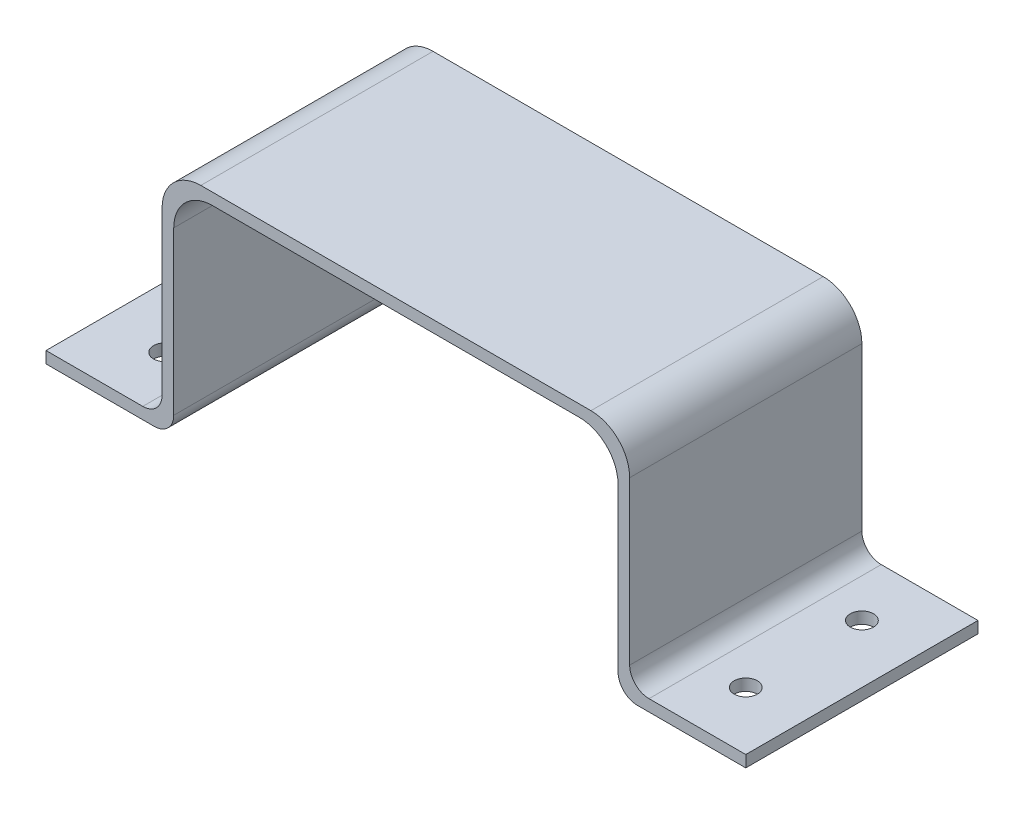
ISO-10303-21;
HEADER;
FILE_DESCRIPTION(('STEP AP214'),'2;1');
FILE_NAME('part.step','',(''),(''),'','','');
FILE_SCHEMA(('AUTOMOTIVE_DESIGN { 1 0 10303 214 1 1 1 1 }'));
ENDSEC;
DATA;
#1=APPLICATION_CONTEXT('core data for automotive mechanical design processes');
#2=APPLICATION_PROTOCOL_DEFINITION('international standard','automotive_design',2000,#1);
#3=PRODUCT_CONTEXT('',#1,'mechanical');
#4=PRODUCT('Part','Part','',(#3));
#5=PRODUCT_RELATED_PRODUCT_CATEGORY('part','',(#4));
#6=PRODUCT_DEFINITION_FORMATION('','',#4);
#7=PRODUCT_DEFINITION_CONTEXT('part definition',#1,'design');
#8=PRODUCT_DEFINITION('design','',#6,#7);
#9=PRODUCT_DEFINITION_SHAPE('','',#8);
#10=(LENGTH_UNIT() NAMED_UNIT(*) SI_UNIT(.MILLI.,.METRE.));
#11=(NAMED_UNIT(*) PLANE_ANGLE_UNIT() SI_UNIT($,.RADIAN.));
#12=(NAMED_UNIT(*) SI_UNIT($,.STERADIAN.) SOLID_ANGLE_UNIT());
#13=UNCERTAINTY_MEASURE_WITH_UNIT(LENGTH_MEASURE(1.E-05),#10,'distance_accuracy_value','');
#14=(GEOMETRIC_REPRESENTATION_CONTEXT(3) GLOBAL_UNCERTAINTY_ASSIGNED_CONTEXT((#13)) GLOBAL_UNIT_ASSIGNED_CONTEXT((#10,
#11,#12)) REPRESENTATION_CONTEXT('',''));
#15=CARTESIAN_POINT('',(0.,0.,0.));
#16=DIRECTION('',(0.,0.,1.));
#17=DIRECTION('',(1.,0.,0.));
#18=AXIS2_PLACEMENT_3D('',#15,#16,#17);
#19=CARTESIAN_POINT('',(0.,-59.94,60.));
#20=DIRECTION('',(0.,1.,0.));
#21=DIRECTION('',(0.,0.,1.));
#22=AXIS2_PLACEMENT_3D('',#19,#20,#21);
#23=PLANE('',#22);
#24=CARTESIAN_POINT('',(15.,-59.94,45.));
#25=DIRECTION('',(0.,1.,0.));
#26=DIRECTION('',(0.,0.,1.));
#27=AXIS2_PLACEMENT_3D('',#24,#25,#26);
#28=CIRCLE('',#27,3.);
#29=CARTESIAN_POINT('',(15.,-59.94,48.));
#30=VERTEX_POINT('',#29);
#31=EDGE_CURVE('E633',#30,#30,#28,.T.);
#32=ORIENTED_EDGE('',*,*,#31,.T.);
#33=EDGE_LOOP('',(#32));
#34=FACE_BOUND('',#33,.T.);
#35=CARTESIAN_POINT('',(15.,-59.94,15.));
#36=DIRECTION('',(0.,1.,0.));
#37=DIRECTION('',(0.,0.,1.));
#38=AXIS2_PLACEMENT_3D('',#35,#36,#37);
#39=CIRCLE('',#38,3.);
#40=CARTESIAN_POINT('',(15.,-59.94,18.));
#41=VERTEX_POINT('',#40);
#42=EDGE_CURVE('E223',#41,#41,#39,.T.);
#43=ORIENTED_EDGE('',*,*,#42,.T.);
#44=EDGE_LOOP('',(#43));
#45=FACE_BOUND('',#44,.T.);
#46=DIRECTION('',(1.,0.,0.));
#47=VECTOR('',#46,1.);
#48=CARTESIAN_POINT('',(0.,-59.94,60.));
#49=LINE('',#48,#47);
#50=CARTESIAN_POINT('',(2.00000000000001,-59.94,60.));
#51=VERTEX_POINT('',#50);
#52=CARTESIAN_POINT('',(30.,-59.94,60.));
#53=VERTEX_POINT('',#52);
#54=EDGE_CURVE('E167',#51,#53,#49,.T.);
#55=ORIENTED_EDGE('',*,*,#54,.F.);
#56=DIRECTION('',(0.,0.,-1.));
#57=VECTOR('',#56,1.);
#58=CARTESIAN_POINT('',(2.00000000000001,-59.94,60.));
#59=LINE('',#58,#57);
#60=CARTESIAN_POINT('',(2.00000000000001,-59.94,0.));
#61=VERTEX_POINT('',#60);
#62=EDGE_CURVE('E40',#51,#61,#59,.T.);
#63=ORIENTED_EDGE('',*,*,#62,.T.);
#64=DIRECTION('',(1.,0.,0.));
#65=VECTOR('',#64,1.);
#66=CARTESIAN_POINT('',(0.,-59.94,0.));
#67=LINE('',#66,#65);
#68=CARTESIAN_POINT('',(30.,-59.94,0.));
#69=VERTEX_POINT('',#68);
#70=EDGE_CURVE('E182',#61,#69,#67,.T.);
#71=ORIENTED_EDGE('',*,*,#70,.T.);
#72=DIRECTION('',(0.,0.,-1.));
#73=VECTOR('',#72,1.);
#74=CARTESIAN_POINT('',(30.,-59.94,60.));
#75=LINE('',#74,#73);
#76=EDGE_CURVE('E180',#53,#69,#75,.T.);
#77=ORIENTED_EDGE('',*,*,#76,.F.);
#78=EDGE_LOOP('',(#55,#63,#71,#77));
#79=FACE_BOUND('',#78,.T.);
#80=ADVANCED_FACE('F32',(#34,#45,#79),#23,.F.);
#81=CARTESIAN_POINT('',(30.,-56.94,60.));
#82=DIRECTION('',(1.,0.,0.));
#83=DIRECTION('',(0.,0.,-1.));
#84=AXIS2_PLACEMENT_3D('',#81,#82,#83);
#85=PLANE('',#84);
#86=DIRECTION('',(0.,-1.,0.));
#87=VECTOR('',#86,1.);
#88=CARTESIAN_POINT('',(30.,-56.94,0.));
#89=LINE('',#88,#87);
#90=CARTESIAN_POINT('',(30.,-56.94,0.));
#91=VERTEX_POINT('',#90);
#92=EDGE_CURVE('E222',#91,#69,#89,.T.);
#93=ORIENTED_EDGE('',*,*,#92,.F.);
#94=DIRECTION('',(0.,0.,-1.));
#95=VECTOR('',#94,1.);
#96=CARTESIAN_POINT('',(30.,-56.94,60.));
#97=LINE('',#96,#95);
#98=CARTESIAN_POINT('',(30.,-56.94,60.));
#99=VERTEX_POINT('',#98);
#100=EDGE_CURVE('E187',#99,#91,#97,.T.);
#101=ORIENTED_EDGE('',*,*,#100,.F.);
#102=DIRECTION('',(0.,-1.,0.));
#103=VECTOR('',#102,1.);
#104=CARTESIAN_POINT('',(30.,-56.94,60.));
#105=LINE('',#104,#103);
#106=EDGE_CURVE('E173',#99,#53,#105,.T.);
#107=ORIENTED_EDGE('',*,*,#106,.T.);
#108=ORIENTED_EDGE('',*,*,#76,.T.);
#109=EDGE_LOOP('',(#93,#101,#107,#108));
#110=FACE_BOUND('',#109,.T.);
#111=ADVANCED_FACE('F190',(#110),#85,.T.);
#112=CARTESIAN_POINT('',(0.,-56.94,60.));
#113=DIRECTION('',(0.,1.,0.));
#114=DIRECTION('',(0.,0.,1.));
#115=AXIS2_PLACEMENT_3D('',#112,#113,#114);
#116=PLANE('',#115);
#117=CARTESIAN_POINT('',(15.,-56.94,45.));
#118=DIRECTION('',(0.,1.,0.));
#119=DIRECTION('',(0.,0.,1.));
#120=AXIS2_PLACEMENT_3D('',#117,#118,#119);
#121=CIRCLE('',#120,3.);
#122=CARTESIAN_POINT('',(15.,-56.94,48.));
#123=VERTEX_POINT('',#122);
#124=EDGE_CURVE('E257',#123,#123,#121,.T.);
#125=ORIENTED_EDGE('',*,*,#124,.F.);
#126=EDGE_LOOP('',(#125));
#127=FACE_BOUND('',#126,.T.);
#128=CARTESIAN_POINT('',(15.,-56.94,15.));
#129=DIRECTION('',(0.,1.,0.));
#130=DIRECTION('',(0.,0.,1.));
#131=AXIS2_PLACEMENT_3D('',#128,#129,#130);
#132=CIRCLE('',#131,3.);
#133=CARTESIAN_POINT('',(15.,-56.94,18.));
#134=VERTEX_POINT('',#133);
#135=EDGE_CURVE('E635',#134,#134,#132,.T.);
#136=ORIENTED_EDGE('',*,*,#135,.F.);
#137=EDGE_LOOP('',(#136));
#138=FACE_BOUND('',#137,.T.);
#139=DIRECTION('',(1.,0.,0.));
#140=VECTOR('',#139,1.);
#141=CARTESIAN_POINT('',(0.,-56.94,0.));
#142=LINE('',#141,#140);
#143=CARTESIAN_POINT('',(5.00000000000001,-56.94,0.));
#144=VERTEX_POINT('',#143);
#145=EDGE_CURVE('E225',#144,#91,#142,.T.);
#146=ORIENTED_EDGE('',*,*,#145,.F.);
#147=DIRECTION('',(0.,0.,-1.));
#148=VECTOR('',#147,1.);
#149=CARTESIAN_POINT('',(5.00000000000001,-56.94,60.));
#150=LINE('',#149,#148);
#151=CARTESIAN_POINT('',(5.00000000000001,-56.94,60.));
#152=VERTEX_POINT('',#151);
#153=EDGE_CURVE('E304',#144,#152,#150,.F.);
#154=ORIENTED_EDGE('',*,*,#153,.T.);
#155=DIRECTION('',(1.,0.,0.));
#156=VECTOR('',#155,1.);
#157=CARTESIAN_POINT('',(0.,-56.94,60.));
#158=LINE('',#157,#156);
#159=EDGE_CURVE('E192',#152,#99,#158,.T.);
#160=ORIENTED_EDGE('',*,*,#159,.T.);
#161=ORIENTED_EDGE('',*,*,#100,.T.);
#162=EDGE_LOOP('',(#146,#154,#160,#161));
#163=FACE_BOUND('',#162,.T.);
#164=ADVANCED_FACE('F338',(#127,#138,#163),#116,.T.);
#165=CARTESIAN_POINT('',(0.,0.,60.));
#166=DIRECTION('',(1.,0.,0.));
#167=DIRECTION('',(0.,1.,0.));
#168=AXIS2_PLACEMENT_3D('',#165,#166,#167);
#169=PLANE('',#168);
#170=DIRECTION('',(0.,-1.,0.));
#171=VECTOR('',#170,1.);
#172=CARTESIAN_POINT('',(0.,0.,60.));
#173=LINE('',#172,#171);
#174=CARTESIAN_POINT('',(0.,-10.,60.));
#175=VERTEX_POINT('',#174);
#176=CARTESIAN_POINT('',(0.,-51.94,60.));
#177=VERTEX_POINT('',#176);
#178=EDGE_CURVE('E194',#175,#177,#173,.T.);
#179=ORIENTED_EDGE('',*,*,#178,.T.);
#180=DIRECTION('',(0.,0.,-1.));
#181=VECTOR('',#180,1.);
#182=CARTESIAN_POINT('',(0.,-51.94,0.));
#183=LINE('',#182,#181);
#184=CARTESIAN_POINT('',(0.,-51.94,0.));
#185=VERTEX_POINT('',#184);
#186=EDGE_CURVE('E301',#177,#185,#183,.T.);
#187=ORIENTED_EDGE('',*,*,#186,.T.);
#188=DIRECTION('',(0.,-1.,0.));
#189=VECTOR('',#188,1.);
#190=CARTESIAN_POINT('',(0.,0.,0.));
#191=LINE('',#190,#189);
#192=CARTESIAN_POINT('',(0.,-10.,0.));
#193=VERTEX_POINT('',#192);
#194=EDGE_CURVE('E227',#193,#185,#191,.T.);
#195=ORIENTED_EDGE('',*,*,#194,.F.);
#196=DIRECTION('',(0.,0.,-1.));
#197=VECTOR('',#196,1.);
#198=CARTESIAN_POINT('',(0.,-10.,60.));
#199=LINE('',#198,#197);
#200=EDGE_CURVE('E271',#193,#175,#199,.F.);
#201=ORIENTED_EDGE('',*,*,#200,.T.);
#202=EDGE_LOOP('',(#179,#187,#195,#201));
#203=FACE_BOUND('',#202,.T.);
#204=ADVANCED_FACE('F346',(#203),#169,.T.);
#205=CARTESIAN_POINT('',(0.,0.,60.));
#206=DIRECTION('',(0.,1.,0.));
#207=DIRECTION('',(-1.,0.,0.));
#208=AXIS2_PLACEMENT_3D('',#205,#206,#207);
#209=PLANE('',#208);
#210=DIRECTION('',(1.,0.,0.));
#211=VECTOR('',#210,1.);
#212=CARTESIAN_POINT('',(0.,0.,60.));
#213=LINE('',#212,#211);
#214=CARTESIAN_POINT('',(-110.8,0.,60.));
#215=VERTEX_POINT('',#214);
#216=CARTESIAN_POINT('',(-10.,0.,60.));
#217=VERTEX_POINT('',#216);
#218=EDGE_CURVE('E200',#215,#217,#213,.T.);
#219=ORIENTED_EDGE('',*,*,#218,.T.);
#220=DIRECTION('',(0.,0.,-1.));
#221=VECTOR('',#220,1.);
#222=CARTESIAN_POINT('',(-10.,0.,60.));
#223=LINE('',#222,#221);
#224=CARTESIAN_POINT('',(-10.,0.,0.));
#225=VERTEX_POINT('',#224);
#226=EDGE_CURVE('E264',#217,#225,#223,.T.);
#227=ORIENTED_EDGE('',*,*,#226,.T.);
#228=DIRECTION('',(1.,0.,0.));
#229=VECTOR('',#228,1.);
#230=CARTESIAN_POINT('',(0.,0.,0.));
#231=LINE('',#230,#229);
#232=CARTESIAN_POINT('',(-110.8,0.,0.));
#233=VERTEX_POINT('',#232);
#234=EDGE_CURVE('E230',#233,#225,#231,.T.);
#235=ORIENTED_EDGE('',*,*,#234,.F.);
#236=DIRECTION('',(0.,0.,-1.));
#237=VECTOR('',#236,1.);
#238=CARTESIAN_POINT('',(-110.8,0.,60.));
#239=LINE('',#238,#237);
#240=EDGE_CURVE('E186',#233,#215,#239,.F.);
#241=ORIENTED_EDGE('',*,*,#240,.T.);
#242=EDGE_LOOP('',(#219,#227,#235,#241));
#243=FACE_BOUND('',#242,.T.);
#244=ADVANCED_FACE('F354',(#243),#209,.T.);
#245=CARTESIAN_POINT('',(-120.8,0.,60.));
#246=DIRECTION('',(-1.,0.,0.));
#247=DIRECTION('',(0.,-1.,0.));
#248=AXIS2_PLACEMENT_3D('',#245,#246,#247);
#249=PLANE('',#248);
#250=DIRECTION('',(0.,1.,0.));
#251=VECTOR('',#250,1.);
#252=CARTESIAN_POINT('',(-120.8,0.,0.));
#253=LINE('',#252,#251);
#254=CARTESIAN_POINT('',(-120.8,-51.94,0.));
#255=VERTEX_POINT('',#254);
#256=CARTESIAN_POINT('',(-120.8,-10.,0.));
#257=VERTEX_POINT('',#256);
#258=EDGE_CURVE('E233',#255,#257,#253,.T.);
#259=ORIENTED_EDGE('',*,*,#258,.F.);
#260=DIRECTION('',(0.,0.,-1.));
#261=VECTOR('',#260,1.);
#262=CARTESIAN_POINT('',(-120.8,-51.94,60.));
#263=LINE('',#262,#261);
#264=CARTESIAN_POINT('',(-120.8,-51.94,60.));
#265=VERTEX_POINT('',#264);
#266=EDGE_CURVE('E309',#255,#265,#263,.F.);
#267=ORIENTED_EDGE('',*,*,#266,.T.);
#268=DIRECTION('',(0.,1.,0.));
#269=VECTOR('',#268,1.);
#270=CARTESIAN_POINT('',(-120.8,0.,60.));
#271=LINE('',#270,#269);
#272=CARTESIAN_POINT('',(-120.8,-10.,60.));
#273=VERTEX_POINT('',#272);
#274=EDGE_CURVE('E203',#265,#273,#271,.T.);
#275=ORIENTED_EDGE('',*,*,#274,.T.);
#276=DIRECTION('',(0.,0.,-1.));
#277=VECTOR('',#276,1.);
#278=CARTESIAN_POINT('',(-120.8,-10.,60.));
#279=LINE('',#278,#277);
#280=EDGE_CURVE('E278',#273,#257,#279,.T.);
#281=ORIENTED_EDGE('',*,*,#280,.T.);
#282=EDGE_LOOP('',(#259,#267,#275,#281));
#283=FACE_BOUND('',#282,.T.);
#284=ADVANCED_FACE('F365',(#283),#249,.T.);
#285=CARTESIAN_POINT('',(-120.8,-56.94,60.));
#286=DIRECTION('',(0.,1.,0.));
#287=DIRECTION('',(0.,0.,1.));
#288=AXIS2_PLACEMENT_3D('',#285,#286,#287);
#289=PLANE('',#288);
#290=CARTESIAN_POINT('',(-135.,-56.94,45.));
#291=DIRECTION('',(0.,1.,0.));
#292=DIRECTION('',(0.,0.,1.));
#293=AXIS2_PLACEMENT_3D('',#290,#291,#292);
#294=CIRCLE('',#293,3.);
#295=CARTESIAN_POINT('',(-135.,-56.94,48.));
#296=VERTEX_POINT('',#295);
#297=EDGE_CURVE('E262',#296,#296,#294,.T.);
#298=ORIENTED_EDGE('',*,*,#297,.F.);
#299=EDGE_LOOP('',(#298));
#300=FACE_BOUND('',#299,.T.);
#301=CARTESIAN_POINT('',(-135.,-56.94,15.));
#302=DIRECTION('',(0.,1.,0.));
#303=DIRECTION('',(0.,0.,1.));
#304=AXIS2_PLACEMENT_3D('',#301,#302,#303);
#305=CIRCLE('',#304,3.);
#306=CARTESIAN_POINT('',(-135.,-56.94,18.));
#307=VERTEX_POINT('',#306);
#308=EDGE_CURVE('E258',#307,#307,#305,.T.);
#309=ORIENTED_EDGE('',*,*,#308,.F.);
#310=EDGE_LOOP('',(#309));
#311=FACE_BOUND('',#310,.T.);
#312=DIRECTION('',(1.,0.,0.));
#313=VECTOR('',#312,1.);
#314=CARTESIAN_POINT('',(-120.8,-56.94,60.));
#315=LINE('',#314,#313);
#316=CARTESIAN_POINT('',(-150.8,-56.94,60.));
#317=VERTEX_POINT('',#316);
#318=CARTESIAN_POINT('',(-125.8,-56.94,60.));
#319=VERTEX_POINT('',#318);
#320=EDGE_CURVE('E205',#317,#319,#315,.T.);
#321=ORIENTED_EDGE('',*,*,#320,.T.);
#322=DIRECTION('',(0.,0.,-1.));
#323=VECTOR('',#322,1.);
#324=CARTESIAN_POINT('',(-125.8,-56.94,0.));
#325=LINE('',#324,#323);
#326=CARTESIAN_POINT('',(-125.8,-56.94,0.));
#327=VERTEX_POINT('',#326);
#328=EDGE_CURVE('E306',#319,#327,#325,.T.);
#329=ORIENTED_EDGE('',*,*,#328,.T.);
#330=DIRECTION('',(1.,0.,0.));
#331=VECTOR('',#330,1.);
#332=CARTESIAN_POINT('',(-120.8,-56.94,0.));
#333=LINE('',#332,#331);
#334=CARTESIAN_POINT('',(-150.8,-56.94,0.));
#335=VERTEX_POINT('',#334);
#336=EDGE_CURVE('E235',#335,#327,#333,.T.);
#337=ORIENTED_EDGE('',*,*,#336,.F.);
#338=DIRECTION('',(0.,0.,-1.));
#339=VECTOR('',#338,1.);
#340=CARTESIAN_POINT('',(-150.8,-56.94,60.));
#341=LINE('',#340,#339);
#342=EDGE_CURVE('E251',#317,#335,#341,.T.);
#343=ORIENTED_EDGE('',*,*,#342,.F.);
#344=EDGE_LOOP('',(#321,#329,#337,#343));
#345=FACE_BOUND('',#344,.T.);
#346=ADVANCED_FACE('F374',(#300,#311,#345),#289,.T.);
#347=CARTESIAN_POINT('',(-150.8,-59.94,60.));
#348=DIRECTION('',(-1.,0.,0.));
#349=DIRECTION('',(0.,0.,1.));
#350=AXIS2_PLACEMENT_3D('',#347,#348,#349);
#351=PLANE('',#350);
#352=DIRECTION('',(0.,1.,0.));
#353=VECTOR('',#352,1.);
#354=CARTESIAN_POINT('',(-150.8,-59.94,0.));
#355=LINE('',#354,#353);
#356=CARTESIAN_POINT('',(-150.8,-59.94,0.));
#357=VERTEX_POINT('',#356);
#358=EDGE_CURVE('E238',#357,#335,#355,.T.);
#359=ORIENTED_EDGE('',*,*,#358,.F.);
#360=DIRECTION('',(0.,0.,-1.));
#361=VECTOR('',#360,1.);
#362=CARTESIAN_POINT('',(-150.8,-59.94,60.));
#363=LINE('',#362,#361);
#364=CARTESIAN_POINT('',(-150.8,-59.94,60.));
#365=VERTEX_POINT('',#364);
#366=EDGE_CURVE('E220',#365,#357,#363,.T.);
#367=ORIENTED_EDGE('',*,*,#366,.F.);
#368=DIRECTION('',(0.,1.,0.));
#369=VECTOR('',#368,1.);
#370=CARTESIAN_POINT('',(-150.8,-59.94,60.));
#371=LINE('',#370,#369);
#372=EDGE_CURVE('E208',#365,#317,#371,.T.);
#373=ORIENTED_EDGE('',*,*,#372,.T.);
#374=ORIENTED_EDGE('',*,*,#342,.T.);
#375=EDGE_LOOP('',(#359,#367,#373,#374));
#376=FACE_BOUND('',#375,.T.);
#377=ADVANCED_FACE('F378',(#376),#351,.T.);
#378=CARTESIAN_POINT('',(-120.8,-59.94,60.));
#379=DIRECTION('',(0.,1.,0.));
#380=DIRECTION('',(0.,0.,1.));
#381=AXIS2_PLACEMENT_3D('',#378,#379,#380);
#382=PLANE('',#381);
#383=CARTESIAN_POINT('',(-135.,-59.94,45.));
#384=DIRECTION('',(0.,1.,0.));
#385=DIRECTION('',(0.,0.,1.));
#386=AXIS2_PLACEMENT_3D('',#383,#384,#385);
#387=CIRCLE('',#386,3.);
#388=CARTESIAN_POINT('',(-135.,-59.94,48.));
#389=VERTEX_POINT('',#388);
#390=EDGE_CURVE('E259',#389,#389,#387,.T.);
#391=ORIENTED_EDGE('',*,*,#390,.T.);
#392=EDGE_LOOP('',(#391));
#393=FACE_BOUND('',#392,.T.);
#394=CARTESIAN_POINT('',(-135.,-59.94,15.));
#395=DIRECTION('',(0.,1.,0.));
#396=DIRECTION('',(0.,0.,1.));
#397=AXIS2_PLACEMENT_3D('',#394,#395,#396);
#398=CIRCLE('',#397,3.);
#399=CARTESIAN_POINT('',(-135.,-59.94,18.));
#400=VERTEX_POINT('',#399);
#401=EDGE_CURVE('E254',#400,#400,#398,.T.);
#402=ORIENTED_EDGE('',*,*,#401,.T.);
#403=EDGE_LOOP('',(#402));
#404=FACE_BOUND('',#403,.T.);
#405=DIRECTION('',(1.,0.,0.));
#406=VECTOR('',#405,1.);
#407=CARTESIAN_POINT('',(-120.8,-59.94,0.));
#408=LINE('',#407,#406);
#409=CARTESIAN_POINT('',(-122.8,-59.94,0.));
#410=VERTEX_POINT('',#409);
#411=EDGE_CURVE('E241',#357,#410,#408,.T.);
#412=ORIENTED_EDGE('',*,*,#411,.T.);
#413=DIRECTION('',(0.,0.,-1.));
#414=VECTOR('',#413,1.);
#415=CARTESIAN_POINT('',(-122.8,-59.94,60.));
#416=LINE('',#415,#414);
#417=CARTESIAN_POINT('',(-122.8,-59.94,60.));
#418=VERTEX_POINT('',#417);
#419=EDGE_CURVE('E326',#410,#418,#416,.F.);
#420=ORIENTED_EDGE('',*,*,#419,.T.);
#421=DIRECTION('',(1.,0.,0.));
#422=VECTOR('',#421,1.);
#423=CARTESIAN_POINT('',(-120.8,-59.94,60.));
#424=LINE('',#423,#422);
#425=EDGE_CURVE('E211',#365,#418,#424,.T.);
#426=ORIENTED_EDGE('',*,*,#425,.F.);
#427=ORIENTED_EDGE('',*,*,#366,.T.);
#428=EDGE_LOOP('',(#412,#420,#426,#427));
#429=FACE_BOUND('',#428,.T.);
#430=ADVANCED_FACE('F482',(#393,#404,#429),#382,.F.);
#431=CARTESIAN_POINT('',(-117.8,0.,60.));
#432=DIRECTION('',(-1.,0.,0.));
#433=DIRECTION('',(0.,-1.,0.));
#434=AXIS2_PLACEMENT_3D('',#431,#432,#433);
#435=PLANE('',#434);
#436=DIRECTION('',(0.,1.,0.));
#437=VECTOR('',#436,1.);
#438=CARTESIAN_POINT('',(-117.8,0.,60.));
#439=LINE('',#438,#437);
#440=CARTESIAN_POINT('',(-117.8,-54.94,60.));
#441=VERTEX_POINT('',#440);
#442=CARTESIAN_POINT('',(-117.8,-13.,60.));
#443=VERTEX_POINT('',#442);
#444=EDGE_CURVE('E213',#441,#443,#439,.T.);
#445=ORIENTED_EDGE('',*,*,#444,.F.);
#446=DIRECTION('',(0.,0.,-1.));
#447=VECTOR('',#446,1.);
#448=CARTESIAN_POINT('',(-117.8,-54.94,60.));
#449=LINE('',#448,#447);
#450=CARTESIAN_POINT('',(-117.8,-54.94,0.));
#451=VERTEX_POINT('',#450);
#452=EDGE_CURVE('E319',#441,#451,#449,.T.);
#453=ORIENTED_EDGE('',*,*,#452,.T.);
#454=DIRECTION('',(0.,1.,0.));
#455=VECTOR('',#454,1.);
#456=CARTESIAN_POINT('',(-117.8,0.,0.));
#457=LINE('',#456,#455);
#458=CARTESIAN_POINT('',(-117.8,-13.,0.));
#459=VERTEX_POINT('',#458);
#460=EDGE_CURVE('E244',#451,#459,#457,.T.);
#461=ORIENTED_EDGE('',*,*,#460,.T.);
#462=DIRECTION('',(0.,0.,-1.));
#463=VECTOR('',#462,1.);
#464=CARTESIAN_POINT('',(-117.8,-13.,60.));
#465=LINE('',#464,#463);
#466=EDGE_CURVE('E286',#459,#443,#465,.F.);
#467=ORIENTED_EDGE('',*,*,#466,.T.);
#468=EDGE_LOOP('',(#445,#453,#461,#467));
#469=FACE_BOUND('',#468,.T.);
#470=ADVANCED_FACE('F389',(#469),#435,.F.);
#471=CARTESIAN_POINT('',(0.,-3.,60.));
#472=DIRECTION('',(0.,1.,0.));
#473=DIRECTION('',(-1.,0.,0.));
#474=AXIS2_PLACEMENT_3D('',#471,#472,#473);
#475=PLANE('',#474);
#476=DIRECTION('',(1.,0.,0.));
#477=VECTOR('',#476,1.);
#478=CARTESIAN_POINT('',(0.,-3.,60.));
#479=LINE('',#478,#477);
#480=CARTESIAN_POINT('',(-107.8,-3.00000000000001,60.));
#481=VERTEX_POINT('',#480);
#482=CARTESIAN_POINT('',(-13.,-3.,60.));
#483=VERTEX_POINT('',#482);
#484=EDGE_CURVE('E215',#481,#483,#479,.T.);
#485=ORIENTED_EDGE('',*,*,#484,.F.);
#486=DIRECTION('',(0.,0.,-1.));
#487=VECTOR('',#486,1.);
#488=CARTESIAN_POINT('',(-107.8,-3.00000000000001,0.));
#489=LINE('',#488,#487);
#490=CARTESIAN_POINT('',(-107.8,-3.00000000000001,0.));
#491=VERTEX_POINT('',#490);
#492=EDGE_CURVE('E283',#481,#491,#489,.T.);
#493=ORIENTED_EDGE('',*,*,#492,.T.);
#494=DIRECTION('',(1.,0.,0.));
#495=VECTOR('',#494,1.);
#496=CARTESIAN_POINT('',(0.,-3.,0.));
#497=LINE('',#496,#495);
#498=CARTESIAN_POINT('',(-13.,-3.,0.));
#499=VERTEX_POINT('',#498);
#500=EDGE_CURVE('E246',#491,#499,#497,.T.);
#501=ORIENTED_EDGE('',*,*,#500,.T.);
#502=DIRECTION('',(0.,0.,-1.));
#503=VECTOR('',#502,1.);
#504=CARTESIAN_POINT('',(-13.,-3.,60.));
#505=LINE('',#504,#503);
#506=EDGE_CURVE('E281',#499,#483,#505,.F.);
#507=ORIENTED_EDGE('',*,*,#506,.T.);
#508=EDGE_LOOP('',(#485,#493,#501,#507));
#509=FACE_BOUND('',#508,.T.);
#510=ADVANCED_FACE('F399',(#509),#475,.F.);
#511=CARTESIAN_POINT('',(-3.,0.,60.));
#512=DIRECTION('',(1.,0.,0.));
#513=DIRECTION('',(0.,1.,0.));
#514=AXIS2_PLACEMENT_3D('',#511,#512,#513);
#515=PLANE('',#514);
#516=DIRECTION('',(0.,-1.,0.));
#517=VECTOR('',#516,1.);
#518=CARTESIAN_POINT('',(-3.,0.,0.));
#519=LINE('',#518,#517);
#520=CARTESIAN_POINT('',(-3.,-13.,0.));
#521=VERTEX_POINT('',#520);
#522=CARTESIAN_POINT('',(-2.99999999999999,-54.94,0.));
#523=VERTEX_POINT('',#522);
#524=EDGE_CURVE('E177',#521,#523,#519,.T.);
#525=ORIENTED_EDGE('',*,*,#524,.T.);
#526=DIRECTION('',(0.,0.,-1.));
#527=VECTOR('',#526,1.);
#528=CARTESIAN_POINT('',(-2.99999999999999,-54.94,60.));
#529=LINE('',#528,#527);
#530=CARTESIAN_POINT('',(-2.99999999999999,-54.94,60.));
#531=VERTEX_POINT('',#530);
#532=EDGE_CURVE('E11',#523,#531,#529,.F.);
#533=ORIENTED_EDGE('',*,*,#532,.T.);
#534=DIRECTION('',(0.,-1.,0.));
#535=VECTOR('',#534,1.);
#536=CARTESIAN_POINT('',(-3.,0.,60.));
#537=LINE('',#536,#535);
#538=CARTESIAN_POINT('',(-3.,-13.,60.));
#539=VERTEX_POINT('',#538);
#540=EDGE_CURVE('E218',#539,#531,#537,.T.);
#541=ORIENTED_EDGE('',*,*,#540,.F.);
#542=DIRECTION('',(0.,0.,-1.));
#543=VECTOR('',#542,1.);
#544=CARTESIAN_POINT('',(-3.,-13.,0.));
#545=LINE('',#544,#543);
#546=EDGE_CURVE('E289',#539,#521,#545,.T.);
#547=ORIENTED_EDGE('',*,*,#546,.T.);
#548=EDGE_LOOP('',(#525,#533,#541,#547));
#549=FACE_BOUND('',#548,.T.);
#550=ADVANCED_FACE('F404',(#549),#515,.F.);
#551=CARTESIAN_POINT('',(0.,0.,60.));
#552=DIRECTION('',(0.,0.,-1.));
#553=DIRECTION('',(-1.,0.,0.));
#554=AXIS2_PLACEMENT_3D('',#551,#552,#553);
#555=PLANE('',#554);
#556=ORIENTED_EDGE('',*,*,#425,.T.);
#557=CARTESIAN_POINT('',(-122.8,-54.94,60.));
#558=DIRECTION('',(0.,0.,-1.));
#559=DIRECTION('',(-1.,0.,0.));
#560=AXIS2_PLACEMENT_3D('',#557,#558,#559);
#561=CIRCLE('',#560,5.);
#562=EDGE_CURVE('E329',#418,#441,#561,.F.);
#563=ORIENTED_EDGE('',*,*,#562,.T.);
#564=ORIENTED_EDGE('',*,*,#444,.T.);
#565=CARTESIAN_POINT('',(-107.8,-13.,60.));
#566=DIRECTION('',(0.,0.,-1.));
#567=DIRECTION('',(-1.,0.,0.));
#568=AXIS2_PLACEMENT_3D('',#565,#566,#567);
#569=CIRCLE('',#568,10.);
#570=EDGE_CURVE('E295',#443,#481,#569,.T.);
#571=ORIENTED_EDGE('',*,*,#570,.T.);
#572=ORIENTED_EDGE('',*,*,#484,.T.);
#573=CARTESIAN_POINT('',(-13.,-13.,60.));
#574=DIRECTION('',(0.,0.,-1.));
#575=DIRECTION('',(-1.,0.,0.));
#576=AXIS2_PLACEMENT_3D('',#573,#574,#575);
#577=CIRCLE('',#576,10.);
#578=EDGE_CURVE('E299',#483,#539,#577,.T.);
#579=ORIENTED_EDGE('',*,*,#578,.T.);
#580=ORIENTED_EDGE('',*,*,#540,.T.);
#581=CARTESIAN_POINT('',(2.00000000000001,-54.94,60.));
#582=DIRECTION('',(0.,0.,-1.));
#583=DIRECTION('',(-1.,0.,0.));
#584=AXIS2_PLACEMENT_3D('',#581,#582,#583);
#585=CIRCLE('',#584,5.);
#586=EDGE_CURVE('E47',#531,#51,#585,.F.);
#587=ORIENTED_EDGE('',*,*,#586,.T.);
#588=ORIENTED_EDGE('',*,*,#54,.T.);
#589=ORIENTED_EDGE('',*,*,#106,.F.);
#590=ORIENTED_EDGE('',*,*,#159,.F.);
#591=CARTESIAN_POINT('',(5.00000000000001,-51.94,60.));
#592=DIRECTION('',(0.,0.,-1.));
#593=DIRECTION('',(-1.,0.,0.));
#594=AXIS2_PLACEMENT_3D('',#591,#592,#593);
#595=CIRCLE('',#594,5.);
#596=EDGE_CURVE('E313',#152,#177,#595,.T.);
#597=ORIENTED_EDGE('',*,*,#596,.T.);
#598=ORIENTED_EDGE('',*,*,#178,.F.);
#599=CARTESIAN_POINT('',(-10.,-10.,60.));
#600=DIRECTION('',(0.,0.,-1.));
#601=DIRECTION('',(-1.,0.,0.));
#602=AXIS2_PLACEMENT_3D('',#599,#600,#601);
#603=CIRCLE('',#602,10.);
#604=EDGE_CURVE('E276',#175,#217,#603,.F.);
#605=ORIENTED_EDGE('',*,*,#604,.T.);
#606=ORIENTED_EDGE('',*,*,#218,.F.);
#607=CARTESIAN_POINT('',(-110.8,-10.,60.));
#608=DIRECTION('',(0.,0.,-1.));
#609=DIRECTION('',(-1.,0.,0.));
#610=AXIS2_PLACEMENT_3D('',#607,#608,#609);
#611=CIRCLE('',#610,10.);
#612=EDGE_CURVE('E273',#215,#273,#611,.F.);
#613=ORIENTED_EDGE('',*,*,#612,.T.);
#614=ORIENTED_EDGE('',*,*,#274,.F.);
#615=CARTESIAN_POINT('',(-125.8,-51.94,60.));
#616=DIRECTION('',(0.,0.,-1.));
#617=DIRECTION('',(-1.,0.,0.));
#618=AXIS2_PLACEMENT_3D('',#615,#616,#617);
#619=CIRCLE('',#618,5.);
#620=EDGE_CURVE('E317',#265,#319,#619,.T.);
#621=ORIENTED_EDGE('',*,*,#620,.T.);
#622=ORIENTED_EDGE('',*,*,#320,.F.);
#623=ORIENTED_EDGE('',*,*,#372,.F.);
#624=EDGE_LOOP('',(#556,#563,#564,#571,#572,#579,#580,#587,#588,#589,#590,#597,#598,#605,#606,
#613,#614,#621,#622,#623));
#625=FACE_BOUND('',#624,.T.);
#626=ADVANCED_FACE('F170',(#625),#555,.F.);
#627=CARTESIAN_POINT('',(0.,0.,0.));
#628=DIRECTION('',(0.,0.,-1.));
#629=DIRECTION('',(-1.,0.,0.));
#630=AXIS2_PLACEMENT_3D('',#627,#628,#629);
#631=PLANE('',#630);
#632=ORIENTED_EDGE('',*,*,#460,.F.);
#633=CARTESIAN_POINT('',(-122.8,-54.94,0.));
#634=DIRECTION('',(0.,0.,-1.));
#635=DIRECTION('',(-1.,0.,0.));
#636=AXIS2_PLACEMENT_3D('',#633,#634,#635);
#637=CIRCLE('',#636,5.);
#638=EDGE_CURVE('E324',#451,#410,#637,.T.);
#639=ORIENTED_EDGE('',*,*,#638,.T.);
#640=ORIENTED_EDGE('',*,*,#411,.F.);
#641=ORIENTED_EDGE('',*,*,#358,.T.);
#642=ORIENTED_EDGE('',*,*,#336,.T.);
#643=CARTESIAN_POINT('',(-125.8,-51.94,0.));
#644=DIRECTION('',(0.,0.,-1.));
#645=DIRECTION('',(-1.,0.,0.));
#646=AXIS2_PLACEMENT_3D('',#643,#644,#645);
#647=CIRCLE('',#646,5.);
#648=EDGE_CURVE('E315',#327,#255,#647,.F.);
#649=ORIENTED_EDGE('',*,*,#648,.T.);
#650=ORIENTED_EDGE('',*,*,#258,.T.);
#651=CARTESIAN_POINT('',(-110.8,-10.,0.));
#652=DIRECTION('',(0.,0.,-1.));
#653=DIRECTION('',(-1.,0.,0.));
#654=AXIS2_PLACEMENT_3D('',#651,#652,#653);
#655=CIRCLE('',#654,10.);
#656=EDGE_CURVE('E267',#257,#233,#655,.T.);
#657=ORIENTED_EDGE('',*,*,#656,.T.);
#658=ORIENTED_EDGE('',*,*,#234,.T.);
#659=CARTESIAN_POINT('',(-10.,-10.,0.));
#660=DIRECTION('',(0.,0.,-1.));
#661=DIRECTION('',(-1.,0.,0.));
#662=AXIS2_PLACEMENT_3D('',#659,#660,#661);
#663=CIRCLE('',#662,10.);
#664=EDGE_CURVE('E269',#225,#193,#663,.T.);
#665=ORIENTED_EDGE('',*,*,#664,.T.);
#666=ORIENTED_EDGE('',*,*,#194,.T.);
#667=CARTESIAN_POINT('',(5.00000000000001,-51.94,0.));
#668=DIRECTION('',(0.,0.,-1.));
#669=DIRECTION('',(-1.,0.,0.));
#670=AXIS2_PLACEMENT_3D('',#667,#668,#669);
#671=CIRCLE('',#670,5.);
#672=EDGE_CURVE('E311',#185,#144,#671,.F.);
#673=ORIENTED_EDGE('',*,*,#672,.T.);
#674=ORIENTED_EDGE('',*,*,#145,.T.);
#675=ORIENTED_EDGE('',*,*,#92,.T.);
#676=ORIENTED_EDGE('',*,*,#70,.F.);
#677=CARTESIAN_POINT('',(2.00000000000001,-54.94,0.));
#678=DIRECTION('',(0.,0.,-1.));
#679=DIRECTION('',(-1.,0.,0.));
#680=AXIS2_PLACEMENT_3D('',#677,#678,#679);
#681=CIRCLE('',#680,5.);
#682=EDGE_CURVE('E322',#61,#523,#681,.T.);
#683=ORIENTED_EDGE('',*,*,#682,.T.);
#684=ORIENTED_EDGE('',*,*,#524,.F.);
#685=CARTESIAN_POINT('',(-13.,-13.,0.));
#686=DIRECTION('',(0.,0.,-1.));
#687=DIRECTION('',(-1.,0.,0.));
#688=AXIS2_PLACEMENT_3D('',#685,#686,#687);
#689=CIRCLE('',#688,10.);
#690=EDGE_CURVE('E297',#521,#499,#689,.F.);
#691=ORIENTED_EDGE('',*,*,#690,.T.);
#692=ORIENTED_EDGE('',*,*,#500,.F.);
#693=CARTESIAN_POINT('',(-107.8,-13.,0.));
#694=DIRECTION('',(0.,0.,-1.));
#695=DIRECTION('',(-1.,0.,0.));
#696=AXIS2_PLACEMENT_3D('',#693,#694,#695);
#697=CIRCLE('',#696,10.);
#698=EDGE_CURVE('E292',#491,#459,#697,.F.);
#699=ORIENTED_EDGE('',*,*,#698,.T.);
#700=EDGE_LOOP('',(#632,#639,#640,#641,#642,#649,#650,#657,#658,#665,#666,#673,#674,#675,#676,
#683,#684,#691,#692,#699));
#701=FACE_BOUND('',#700,.T.);
#702=ADVANCED_FACE('F333',(#701),#631,.T.);
#703=CARTESIAN_POINT('',(15.,-66.94,15.));
#704=DIRECTION('',(0.,1.,0.));
#705=DIRECTION('',(0.,0.,1.));
#706=AXIS2_PLACEMENT_3D('',#703,#704,#705);
#707=CYLINDRICAL_SURFACE('',#706,3.);
#708=ORIENTED_EDGE('',*,*,#135,.T.);
#709=EDGE_LOOP('',(#708));
#710=FACE_BOUND('',#709,.T.);
#711=ORIENTED_EDGE('',*,*,#42,.F.);
#712=EDGE_LOOP('',(#711));
#713=FACE_BOUND('',#712,.T.);
#714=ADVANCED_FACE('F453',(#710,#713),#707,.F.);
#715=CARTESIAN_POINT('',(15.,-66.94,45.));
#716=DIRECTION('',(0.,1.,0.));
#717=DIRECTION('',(0.,0.,1.));
#718=AXIS2_PLACEMENT_3D('',#715,#716,#717);
#719=CYLINDRICAL_SURFACE('',#718,3.);
#720=ORIENTED_EDGE('',*,*,#124,.T.);
#721=EDGE_LOOP('',(#720));
#722=FACE_BOUND('',#721,.T.);
#723=ORIENTED_EDGE('',*,*,#31,.F.);
#724=EDGE_LOOP('',(#723));
#725=FACE_BOUND('',#724,.T.);
#726=ADVANCED_FACE('F554',(#722,#725),#719,.F.);
#727=CARTESIAN_POINT('',(-135.,-66.94,15.));
#728=DIRECTION('',(0.,1.,0.));
#729=DIRECTION('',(0.,0.,1.));
#730=AXIS2_PLACEMENT_3D('',#727,#728,#729);
#731=CYLINDRICAL_SURFACE('',#730,3.);
#732=ORIENTED_EDGE('',*,*,#308,.T.);
#733=EDGE_LOOP('',(#732));
#734=FACE_BOUND('',#733,.T.);
#735=ORIENTED_EDGE('',*,*,#401,.F.);
#736=EDGE_LOOP('',(#735));
#737=FACE_BOUND('',#736,.T.);
#738=ADVANCED_FACE('F564',(#734,#737),#731,.F.);
#739=CARTESIAN_POINT('',(-135.,-66.94,45.));
#740=DIRECTION('',(0.,1.,0.));
#741=DIRECTION('',(0.,0.,1.));
#742=AXIS2_PLACEMENT_3D('',#739,#740,#741);
#743=CYLINDRICAL_SURFACE('',#742,3.);
#744=ORIENTED_EDGE('',*,*,#297,.T.);
#745=EDGE_LOOP('',(#744));
#746=FACE_BOUND('',#745,.T.);
#747=ORIENTED_EDGE('',*,*,#390,.F.);
#748=EDGE_LOOP('',(#747));
#749=FACE_BOUND('',#748,.T.);
#750=ADVANCED_FACE('F422',(#746,#749),#743,.F.);
#751=CARTESIAN_POINT('',(-10.,-10.,60.));
#752=DIRECTION('',(0.,0.,-1.));
#753=DIRECTION('',(-1.,0.,0.));
#754=AXIS2_PLACEMENT_3D('',#751,#752,#753);
#755=CYLINDRICAL_SURFACE('',#754,10.);
#756=ORIENTED_EDGE('',*,*,#604,.F.);
#757=ORIENTED_EDGE('',*,*,#200,.F.);
#758=ORIENTED_EDGE('',*,*,#664,.F.);
#759=ORIENTED_EDGE('',*,*,#226,.F.);
#760=EDGE_LOOP('',(#756,#757,#758,#759));
#761=FACE_BOUND('',#760,.T.);
#762=ADVANCED_FACE('F352',(#761),#755,.T.);
#763=CARTESIAN_POINT('',(-110.8,-10.,60.));
#764=DIRECTION('',(0.,0.,-1.));
#765=DIRECTION('',(-1.,0.,0.));
#766=AXIS2_PLACEMENT_3D('',#763,#764,#765);
#767=CYLINDRICAL_SURFACE('',#766,10.);
#768=ORIENTED_EDGE('',*,*,#612,.F.);
#769=ORIENTED_EDGE('',*,*,#240,.F.);
#770=ORIENTED_EDGE('',*,*,#656,.F.);
#771=ORIENTED_EDGE('',*,*,#280,.F.);
#772=EDGE_LOOP('',(#768,#769,#770,#771));
#773=FACE_BOUND('',#772,.T.);
#774=ADVANCED_FACE('F361',(#773),#767,.T.);
#775=CARTESIAN_POINT('',(-107.8,-13.,60.));
#776=DIRECTION('',(0.,0.,1.));
#777=DIRECTION('',(1.,0.,0.));
#778=AXIS2_PLACEMENT_3D('',#775,#776,#777);
#779=CYLINDRICAL_SURFACE('',#778,10.);
#780=ORIENTED_EDGE('',*,*,#570,.F.);
#781=ORIENTED_EDGE('',*,*,#466,.F.);
#782=ORIENTED_EDGE('',*,*,#698,.F.);
#783=ORIENTED_EDGE('',*,*,#492,.F.);
#784=EDGE_LOOP('',(#780,#781,#782,#783));
#785=FACE_BOUND('',#784,.T.);
#786=ADVANCED_FACE('F395',(#785),#779,.F.);
#787=CARTESIAN_POINT('',(-13.,-13.,60.));
#788=DIRECTION('',(0.,0.,1.));
#789=DIRECTION('',(1.,0.,0.));
#790=AXIS2_PLACEMENT_3D('',#787,#788,#789);
#791=CYLINDRICAL_SURFACE('',#790,10.);
#792=ORIENTED_EDGE('',*,*,#578,.F.);
#793=ORIENTED_EDGE('',*,*,#506,.F.);
#794=ORIENTED_EDGE('',*,*,#690,.F.);
#795=ORIENTED_EDGE('',*,*,#546,.F.);
#796=EDGE_LOOP('',(#792,#793,#794,#795));
#797=FACE_BOUND('',#796,.T.);
#798=ADVANCED_FACE('F402',(#797),#791,.F.);
#799=CARTESIAN_POINT('',(5.00000000000001,-51.94,60.));
#800=DIRECTION('',(0.,0.,1.));
#801=DIRECTION('',(1.,0.,0.));
#802=AXIS2_PLACEMENT_3D('',#799,#800,#801);
#803=CYLINDRICAL_SURFACE('',#802,5.);
#804=ORIENTED_EDGE('',*,*,#596,.F.);
#805=ORIENTED_EDGE('',*,*,#153,.F.);
#806=ORIENTED_EDGE('',*,*,#672,.F.);
#807=ORIENTED_EDGE('',*,*,#186,.F.);
#808=EDGE_LOOP('',(#804,#805,#806,#807));
#809=FACE_BOUND('',#808,.T.);
#810=ADVANCED_FACE('F343',(#809),#803,.F.);
#811=CARTESIAN_POINT('',(-125.8,-51.94,60.));
#812=DIRECTION('',(0.,0.,1.));
#813=DIRECTION('',(1.,0.,0.));
#814=AXIS2_PLACEMENT_3D('',#811,#812,#813);
#815=CYLINDRICAL_SURFACE('',#814,5.);
#816=ORIENTED_EDGE('',*,*,#620,.F.);
#817=ORIENTED_EDGE('',*,*,#266,.F.);
#818=ORIENTED_EDGE('',*,*,#648,.F.);
#819=ORIENTED_EDGE('',*,*,#328,.F.);
#820=EDGE_LOOP('',(#816,#817,#818,#819));
#821=FACE_BOUND('',#820,.T.);
#822=ADVANCED_FACE('F371',(#821),#815,.F.);
#823=CARTESIAN_POINT('',(-122.8,-54.94,60.));
#824=DIRECTION('',(0.,0.,-1.));
#825=DIRECTION('',(-1.,0.,0.));
#826=AXIS2_PLACEMENT_3D('',#823,#824,#825);
#827=CYLINDRICAL_SURFACE('',#826,5.);
#828=ORIENTED_EDGE('',*,*,#562,.F.);
#829=ORIENTED_EDGE('',*,*,#419,.F.);
#830=ORIENTED_EDGE('',*,*,#638,.F.);
#831=ORIENTED_EDGE('',*,*,#452,.F.);
#832=EDGE_LOOP('',(#828,#829,#830,#831));
#833=FACE_BOUND('',#832,.T.);
#834=ADVANCED_FACE('F387',(#833),#827,.T.);
#835=CARTESIAN_POINT('',(2.00000000000001,-54.94,60.));
#836=DIRECTION('',(0.,0.,-1.));
#837=DIRECTION('',(-1.,0.,0.));
#838=AXIS2_PLACEMENT_3D('',#835,#836,#837);
#839=CYLINDRICAL_SURFACE('',#838,5.);
#840=ORIENTED_EDGE('',*,*,#586,.F.);
#841=ORIENTED_EDGE('',*,*,#532,.F.);
#842=ORIENTED_EDGE('',*,*,#682,.F.);
#843=ORIENTED_EDGE('',*,*,#62,.F.);
#844=EDGE_LOOP('',(#840,#841,#842,#843));
#845=FACE_BOUND('',#844,.T.);
#846=ADVANCED_FACE('F34',(#845),#839,.T.);
#847=CLOSED_SHELL('',(#80,#111,#164,#204,#244,#284,#346,#377,#430,#470,#510,#550,#626,#702,#714,
#726,#738,#750,#762,#774,#786,#798,#810,#822,#834,#846));
#848=MANIFOLD_SOLID_BREP('B2',#847);
#849=ADVANCED_BREP_SHAPE_REPRESENTATION('',(#18,#848),#14);
#850=SHAPE_DEFINITION_REPRESENTATION(#9,#849);
ENDSEC;
END-ISO-10303-21;
